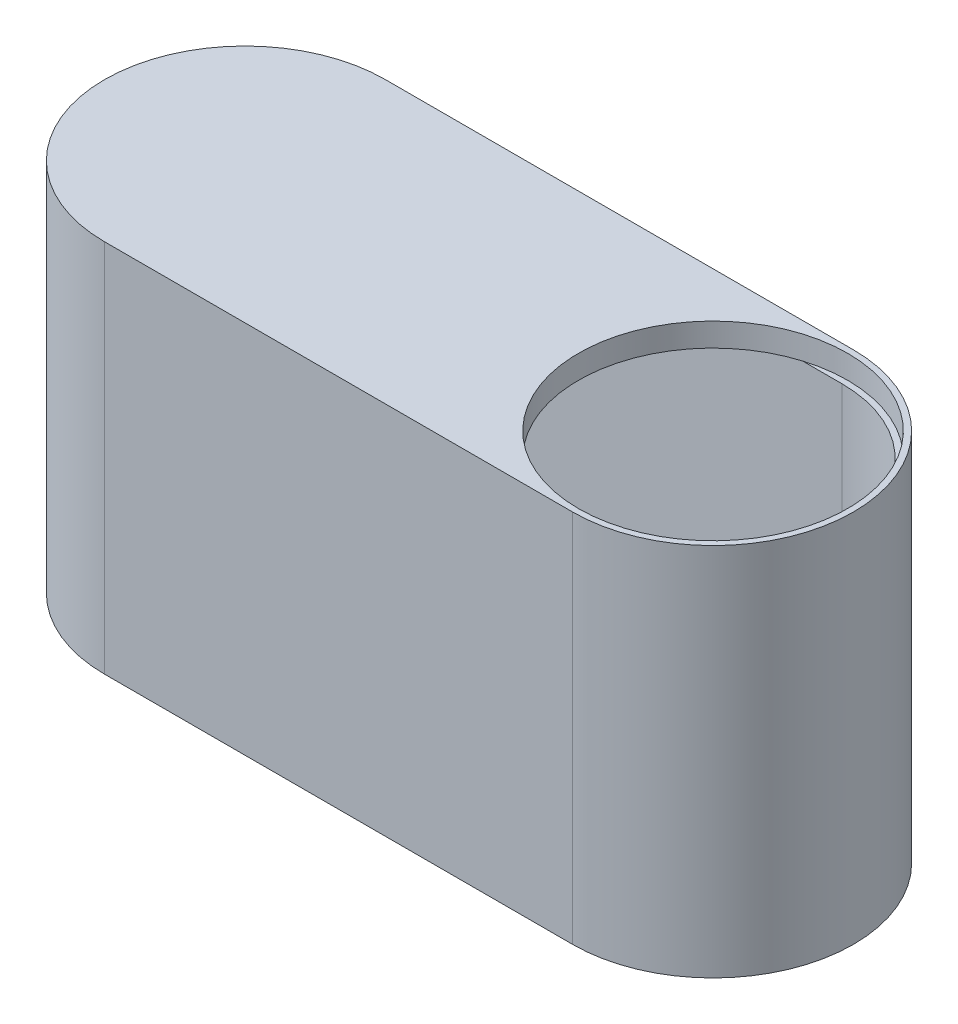
ISO-10303-21;
HEADER;
FILE_DESCRIPTION(('STEP AP214'),'2;1');
FILE_NAME('part.step','',(''),(''),'','','');
FILE_SCHEMA(('AUTOMOTIVE_DESIGN { 1 0 10303 214 1 1 1 1 }'));
ENDSEC;
DATA;
#1=APPLICATION_CONTEXT('core data for automotive mechanical design processes');
#2=APPLICATION_PROTOCOL_DEFINITION('international standard','automotive_design',2000,#1);
#3=PRODUCT_CONTEXT('',#1,'mechanical');
#4=PRODUCT('Part','Part','',(#3));
#5=PRODUCT_RELATED_PRODUCT_CATEGORY('part','',(#4));
#6=PRODUCT_DEFINITION_FORMATION('','',#4);
#7=PRODUCT_DEFINITION_CONTEXT('part definition',#1,'design');
#8=PRODUCT_DEFINITION('design','',#6,#7);
#9=PRODUCT_DEFINITION_SHAPE('','',#8);
#10=(LENGTH_UNIT() NAMED_UNIT(*) SI_UNIT(.MILLI.,.METRE.));
#11=(NAMED_UNIT(*) PLANE_ANGLE_UNIT() SI_UNIT($,.RADIAN.));
#12=(NAMED_UNIT(*) SI_UNIT($,.STERADIAN.) SOLID_ANGLE_UNIT());
#13=UNCERTAINTY_MEASURE_WITH_UNIT(LENGTH_MEASURE(1.E-05),#10,'distance_accuracy_value','');
#14=(GEOMETRIC_REPRESENTATION_CONTEXT(3) GLOBAL_UNCERTAINTY_ASSIGNED_CONTEXT((#13)) GLOBAL_UNIT_ASSIGNED_CONTEXT((#10,
#11,#12)) REPRESENTATION_CONTEXT('',''));
#15=CARTESIAN_POINT('',(0.,0.,0.));
#16=DIRECTION('',(0.,0.,1.));
#17=DIRECTION('',(1.,0.,0.));
#18=AXIS2_PLACEMENT_3D('',#15,#16,#17);
#19=CARTESIAN_POINT('',(77.2984425100702,30.,-53.6856409495745));
#20=DIRECTION('',(0.,1.,0.));
#21=DIRECTION('',(0.,0.,1.));
#22=AXIS2_PLACEMENT_3D('',#19,#20,#21);
#23=PLANE('',#22);
#24=DIRECTION('',(1.,0.,0.));
#25=VECTOR('',#24,1.);
#26=CARTESIAN_POINT('',(77.2984425100702,30.,-42.6856409495745));
#27=LINE('',#26,#25);
#28=CARTESIAN_POINT('',(113.944340543821,30.,-42.6856409495744));
#29=VERTEX_POINT('',#28);
#30=CARTESIAN_POINT('',(117.29844251007,30.,-42.6856409495744));
#31=VERTEX_POINT('',#30);
#32=EDGE_CURVE('E140',#29,#31,#27,.T.);
#33=ORIENTED_EDGE('',*,*,#32,.F.);
#34=CARTESIAN_POINT('',(117.29844251007,30.,-53.6856409495745));
#35=DIRECTION('',(0.,1.,0.));
#36=DIRECTION('',(0.,0.,1.));
#37=AXIS2_PLACEMENT_3D('',#34,#35,#36);
#38=CIRCLE('',#37,11.5);
#39=CARTESIAN_POINT('',(113.944340543821,30.,-64.6856409495745));
#40=VERTEX_POINT('',#39);
#41=EDGE_CURVE('E11',#29,#40,#38,.T.);
#42=ORIENTED_EDGE('',*,*,#41,.T.);
#43=DIRECTION('',(-1.,0.,0.));
#44=VECTOR('',#43,1.);
#45=CARTESIAN_POINT('',(77.2984425100702,30.,-64.6856409495745));
#46=LINE('',#45,#44);
#47=CARTESIAN_POINT('',(117.29844251007,30.,-64.6856409495745));
#48=VERTEX_POINT('',#47);
#49=EDGE_CURVE('E148',#48,#40,#46,.T.);
#50=ORIENTED_EDGE('',*,*,#49,.F.);
#51=CARTESIAN_POINT('',(117.29844251007,30.,-53.6856409495745));
#52=DIRECTION('',(0.,1.,0.));
#53=DIRECTION('',(0.,0.,1.));
#54=AXIS2_PLACEMENT_3D('',#51,#52,#53);
#55=CIRCLE('',#54,11.);
#56=EDGE_CURVE('E145',#31,#48,#55,.T.);
#57=ORIENTED_EDGE('',*,*,#56,.F.);
#58=EDGE_LOOP('',(#33,#42,#50,#57));
#59=FACE_BOUND('',#58,.T.);
#60=ADVANCED_FACE('F33',(#59),#23,.T.);
#61=CARTESIAN_POINT('',(77.2984425100702,0.,-53.6856409495745));
#62=DIRECTION('',(0.,1.,0.));
#63=DIRECTION('',(0.,0.,1.));
#64=AXIS2_PLACEMENT_3D('',#61,#62,#63);
#65=PLANE('',#64);
#66=CARTESIAN_POINT('',(77.2984425100702,0.,-53.6856409495745));
#67=DIRECTION('',(0.,1.,0.));
#68=DIRECTION('',(0.,0.,1.));
#69=AXIS2_PLACEMENT_3D('',#66,#67,#68);
#70=CIRCLE('',#69,12.);
#71=CARTESIAN_POINT('',(77.2984425100702,0.,-65.6856409495745));
#72=VERTEX_POINT('',#71);
#73=CARTESIAN_POINT('',(77.2984425100702,0.,-41.6856409495744));
#74=VERTEX_POINT('',#73);
#75=EDGE_CURVE('E112',#72,#74,#70,.T.);
#76=ORIENTED_EDGE('',*,*,#75,.F.);
#77=DIRECTION('',(-1.,0.,0.));
#78=VECTOR('',#77,1.);
#79=CARTESIAN_POINT('',(77.2984425100702,0.,-65.6856409495745));
#80=LINE('',#79,#78);
#81=CARTESIAN_POINT('',(117.29844251007,0.,-65.6856409495745));
#82=VERTEX_POINT('',#81);
#83=EDGE_CURVE('E174',#82,#72,#80,.T.);
#84=ORIENTED_EDGE('',*,*,#83,.F.);
#85=CARTESIAN_POINT('',(117.29844251007,0.,-53.6856409495745));
#86=DIRECTION('',(0.,1.,0.));
#87=DIRECTION('',(0.,0.,1.));
#88=AXIS2_PLACEMENT_3D('',#85,#86,#87);
#89=CIRCLE('',#88,12.);
#90=CARTESIAN_POINT('',(117.29844251007,0.,-41.6856409495744));
#91=VERTEX_POINT('',#90);
#92=EDGE_CURVE('E172',#91,#82,#89,.T.);
#93=ORIENTED_EDGE('',*,*,#92,.F.);
#94=DIRECTION('',(1.,0.,0.));
#95=VECTOR('',#94,1.);
#96=CARTESIAN_POINT('',(77.2984425100702,0.,-41.6856409495744));
#97=LINE('',#96,#95);
#98=EDGE_CURVE('E170',#74,#91,#97,.T.);
#99=ORIENTED_EDGE('',*,*,#98,.F.);
#100=EDGE_LOOP('',(#76,#84,#93,#99));
#101=FACE_BOUND('',#100,.T.);
#102=CARTESIAN_POINT('',(77.2984425100702,0.,-53.6856409495745));
#103=DIRECTION('',(0.,1.,0.));
#104=DIRECTION('',(0.,0.,1.));
#105=AXIS2_PLACEMENT_3D('',#102,#103,#104);
#106=CIRCLE('',#105,11.);
#107=CARTESIAN_POINT('',(77.2984425100702,0.,-64.6856409495745));
#108=VERTEX_POINT('',#107);
#109=CARTESIAN_POINT('',(77.2984425100702,0.,-42.6856409495745));
#110=VERTEX_POINT('',#109);
#111=EDGE_CURVE('E136',#108,#110,#106,.T.);
#112=ORIENTED_EDGE('',*,*,#111,.T.);
#113=DIRECTION('',(1.,0.,0.));
#114=VECTOR('',#113,1.);
#115=CARTESIAN_POINT('',(77.2984425100702,0.,-42.6856409495745));
#116=LINE('',#115,#114);
#117=CARTESIAN_POINT('',(117.29844251007,0.,-42.6856409495744));
#118=VERTEX_POINT('',#117);
#119=EDGE_CURVE('E153',#110,#118,#116,.T.);
#120=ORIENTED_EDGE('',*,*,#119,.T.);
#121=CARTESIAN_POINT('',(117.29844251007,0.,-53.6856409495745));
#122=DIRECTION('',(0.,1.,0.));
#123=DIRECTION('',(0.,0.,1.));
#124=AXIS2_PLACEMENT_3D('',#121,#122,#123);
#125=CIRCLE('',#124,11.);
#126=CARTESIAN_POINT('',(117.29844251007,0.,-64.6856409495745));
#127=VERTEX_POINT('',#126);
#128=EDGE_CURVE('E156',#118,#127,#125,.T.);
#129=ORIENTED_EDGE('',*,*,#128,.T.);
#130=DIRECTION('',(-1.,0.,0.));
#131=VECTOR('',#130,1.);
#132=CARTESIAN_POINT('',(77.2984425100702,0.,-64.6856409495745));
#133=LINE('',#132,#131);
#134=EDGE_CURVE('E141',#127,#108,#133,.T.);
#135=ORIENTED_EDGE('',*,*,#134,.T.);
#136=EDGE_LOOP('',(#112,#120,#129,#135));
#137=FACE_BOUND('',#136,.T.);
#138=ADVANCED_FACE('F185',(#101,#137),#65,.F.);
#139=CARTESIAN_POINT('',(77.2984425100702,30.,-53.6856409495745));
#140=DIRECTION('',(0.,-1.,0.));
#141=DIRECTION('',(0.,0.,-1.));
#142=AXIS2_PLACEMENT_3D('',#139,#140,#141);
#143=CYLINDRICAL_SURFACE('',#142,12.);
#144=ORIENTED_EDGE('',*,*,#75,.T.);
#145=DIRECTION('',(0.,-1.,0.));
#146=VECTOR('',#145,1.);
#147=CARTESIAN_POINT('',(77.2984425100702,30.,-41.6856409495744));
#148=LINE('',#147,#146);
#149=CARTESIAN_POINT('',(77.2984425100702,32.,-41.6856409495744));
#150=VERTEX_POINT('',#149);
#151=EDGE_CURVE('E37',#150,#74,#148,.T.);
#152=ORIENTED_EDGE('',*,*,#151,.F.);
#153=CARTESIAN_POINT('',(77.2984425100702,32.,-53.6856409495745));
#154=DIRECTION('',(0.,1.,0.));
#155=DIRECTION('',(0.,0.,1.));
#156=AXIS2_PLACEMENT_3D('',#153,#154,#155);
#157=CIRCLE('',#156,12.);
#158=CARTESIAN_POINT('',(77.2984425100702,32.,-65.6856409495745));
#159=VERTEX_POINT('',#158);
#160=EDGE_CURVE('E110',#159,#150,#157,.T.);
#161=ORIENTED_EDGE('',*,*,#160,.F.);
#162=DIRECTION('',(0.,-1.,0.));
#163=VECTOR('',#162,1.);
#164=CARTESIAN_POINT('',(77.2984425100702,30.,-65.6856409495745));
#165=LINE('',#164,#163);
#166=EDGE_CURVE('E176',#159,#72,#165,.T.);
#167=ORIENTED_EDGE('',*,*,#166,.T.);
#168=EDGE_LOOP('',(#144,#152,#161,#167));
#169=FACE_BOUND('',#168,.T.);
#170=ADVANCED_FACE('F35',(#169),#143,.T.);
#171=CARTESIAN_POINT('',(77.2984425100702,30.,-41.6856409495744));
#172=DIRECTION('',(0.,0.,-1.));
#173=DIRECTION('',(-1.,0.,0.));
#174=AXIS2_PLACEMENT_3D('',#171,#172,#173);
#175=PLANE('',#174);
#176=ORIENTED_EDGE('',*,*,#98,.T.);
#177=DIRECTION('',(0.,-1.,0.));
#178=VECTOR('',#177,1.);
#179=CARTESIAN_POINT('',(117.29844251007,30.,-41.6856409495744));
#180=LINE('',#179,#178);
#181=CARTESIAN_POINT('',(117.29844251007,32.,-41.6856409495744));
#182=VERTEX_POINT('',#181);
#183=EDGE_CURVE('E114',#182,#91,#180,.T.);
#184=ORIENTED_EDGE('',*,*,#183,.F.);
#185=DIRECTION('',(1.,0.,0.));
#186=VECTOR('',#185,1.);
#187=CARTESIAN_POINT('',(77.2984425100702,32.,-41.6856409495744));
#188=LINE('',#187,#186);
#189=EDGE_CURVE('E116',#150,#182,#188,.T.);
#190=ORIENTED_EDGE('',*,*,#189,.F.);
#191=ORIENTED_EDGE('',*,*,#151,.T.);
#192=EDGE_LOOP('',(#176,#184,#190,#191));
#193=FACE_BOUND('',#192,.T.);
#194=ADVANCED_FACE('F117',(#193),#175,.F.);
#195=CARTESIAN_POINT('',(117.29844251007,30.,-53.6856409495745));
#196=DIRECTION('',(0.,-1.,0.));
#197=DIRECTION('',(0.,0.,-1.));
#198=AXIS2_PLACEMENT_3D('',#195,#196,#197);
#199=CYLINDRICAL_SURFACE('',#198,12.);
#200=ORIENTED_EDGE('',*,*,#92,.T.);
#201=DIRECTION('',(0.,-1.,0.));
#202=VECTOR('',#201,1.);
#203=CARTESIAN_POINT('',(117.29844251007,30.,-65.6856409495745));
#204=LINE('',#203,#202);
#205=CARTESIAN_POINT('',(117.29844251007,32.,-65.6856409495745));
#206=VERTEX_POINT('',#205);
#207=EDGE_CURVE('E178',#206,#82,#204,.T.);
#208=ORIENTED_EDGE('',*,*,#207,.F.);
#209=CARTESIAN_POINT('',(117.29844251007,32.,-53.6856409495745));
#210=DIRECTION('',(0.,1.,0.));
#211=DIRECTION('',(0.,0.,1.));
#212=AXIS2_PLACEMENT_3D('',#209,#210,#211);
#213=CIRCLE('',#212,12.);
#214=EDGE_CURVE('E122',#182,#206,#213,.T.);
#215=ORIENTED_EDGE('',*,*,#214,.F.);
#216=ORIENTED_EDGE('',*,*,#183,.T.);
#217=EDGE_LOOP('',(#200,#208,#215,#216));
#218=FACE_BOUND('',#217,.T.);
#219=ADVANCED_FACE('F182',(#218),#199,.T.);
#220=CARTESIAN_POINT('',(77.2984425100702,30.,-65.6856409495745));
#221=DIRECTION('',(0.,0.,1.));
#222=DIRECTION('',(1.,0.,0.));
#223=AXIS2_PLACEMENT_3D('',#220,#221,#222);
#224=PLANE('',#223);
#225=ORIENTED_EDGE('',*,*,#83,.T.);
#226=ORIENTED_EDGE('',*,*,#166,.F.);
#227=DIRECTION('',(-1.,0.,0.));
#228=VECTOR('',#227,1.);
#229=CARTESIAN_POINT('',(77.2984425100702,32.,-65.6856409495745));
#230=LINE('',#229,#228);
#231=EDGE_CURVE('E128',#206,#159,#230,.T.);
#232=ORIENTED_EDGE('',*,*,#231,.F.);
#233=ORIENTED_EDGE('',*,*,#207,.T.);
#234=EDGE_LOOP('',(#225,#226,#232,#233));
#235=FACE_BOUND('',#234,.T.);
#236=ADVANCED_FACE('F188',(#235),#224,.F.);
#237=CARTESIAN_POINT('',(77.2984425100702,30.,-53.6856409495745));
#238=DIRECTION('',(0.,-1.,0.));
#239=DIRECTION('',(0.,0.,-1.));
#240=AXIS2_PLACEMENT_3D('',#237,#238,#239);
#241=CYLINDRICAL_SURFACE('',#240,11.);
#242=ORIENTED_EDGE('',*,*,#111,.F.);
#243=DIRECTION('',(0.,-1.,0.));
#244=VECTOR('',#243,1.);
#245=CARTESIAN_POINT('',(77.2984425100702,30.,-64.6856409495745));
#246=LINE('',#245,#244);
#247=CARTESIAN_POINT('',(77.2984425100702,30.,-64.6856409495745));
#248=VERTEX_POINT('',#247);
#249=EDGE_CURVE('E150',#248,#108,#246,.T.);
#250=ORIENTED_EDGE('',*,*,#249,.F.);
#251=CARTESIAN_POINT('',(77.2984425100702,30.,-53.6856409495745));
#252=DIRECTION('',(0.,1.,0.));
#253=DIRECTION('',(0.,0.,1.));
#254=AXIS2_PLACEMENT_3D('',#251,#252,#253);
#255=CIRCLE('',#254,11.);
#256=CARTESIAN_POINT('',(77.2984425100702,30.,-42.6856409495745));
#257=VERTEX_POINT('',#256);
#258=EDGE_CURVE('E137',#248,#257,#255,.T.);
#259=ORIENTED_EDGE('',*,*,#258,.T.);
#260=DIRECTION('',(0.,-1.,0.));
#261=VECTOR('',#260,1.);
#262=CARTESIAN_POINT('',(77.2984425100702,30.,-42.6856409495745));
#263=LINE('',#262,#261);
#264=EDGE_CURVE('E166',#257,#110,#263,.T.);
#265=ORIENTED_EDGE('',*,*,#264,.T.);
#266=EDGE_LOOP('',(#242,#250,#259,#265));
#267=FACE_BOUND('',#266,.T.);
#268=ADVANCED_FACE('F190',(#267),#241,.F.);
#269=CARTESIAN_POINT('',(77.2984425100702,30.,-42.6856409495745));
#270=DIRECTION('',(0.,0.,-1.));
#271=DIRECTION('',(-1.,0.,0.));
#272=AXIS2_PLACEMENT_3D('',#269,#270,#271);
#273=PLANE('',#272);
#274=ORIENTED_EDGE('',*,*,#119,.F.);
#275=ORIENTED_EDGE('',*,*,#264,.F.);
#276=EDGE_CURVE('E142',#257,#29,#27,.T.);
#277=ORIENTED_EDGE('',*,*,#276,.T.);
#278=ORIENTED_EDGE('',*,*,#32,.T.);
#279=DIRECTION('',(0.,-1.,0.));
#280=VECTOR('',#279,1.);
#281=CARTESIAN_POINT('',(117.29844251007,30.,-42.6856409495744));
#282=LINE('',#281,#280);
#283=EDGE_CURVE('E164',#31,#118,#282,.T.);
#284=ORIENTED_EDGE('',*,*,#283,.T.);
#285=EDGE_LOOP('',(#274,#275,#277,#278,#284));
#286=FACE_BOUND('',#285,.T.);
#287=ADVANCED_FACE('F196',(#286),#273,.T.);
#288=CARTESIAN_POINT('',(117.29844251007,30.,-53.6856409495745));
#289=DIRECTION('',(0.,-1.,0.));
#290=DIRECTION('',(0.,0.,-1.));
#291=AXIS2_PLACEMENT_3D('',#288,#289,#290);
#292=CYLINDRICAL_SURFACE('',#291,11.);
#293=ORIENTED_EDGE('',*,*,#128,.F.);
#294=ORIENTED_EDGE('',*,*,#283,.F.);
#295=ORIENTED_EDGE('',*,*,#56,.T.);
#296=DIRECTION('',(0.,-1.,0.));
#297=VECTOR('',#296,1.);
#298=CARTESIAN_POINT('',(117.29844251007,30.,-64.6856409495745));
#299=LINE('',#298,#297);
#300=EDGE_CURVE('E56',#48,#127,#299,.T.);
#301=ORIENTED_EDGE('',*,*,#300,.T.);
#302=EDGE_LOOP('',(#293,#294,#295,#301));
#303=FACE_BOUND('',#302,.T.);
#304=ADVANCED_FACE('F211',(#303),#292,.F.);
#305=CARTESIAN_POINT('',(77.2984425100702,30.,-64.6856409495745));
#306=DIRECTION('',(0.,0.,1.));
#307=DIRECTION('',(1.,0.,0.));
#308=AXIS2_PLACEMENT_3D('',#305,#306,#307);
#309=PLANE('',#308);
#310=ORIENTED_EDGE('',*,*,#134,.F.);
#311=ORIENTED_EDGE('',*,*,#300,.F.);
#312=ORIENTED_EDGE('',*,*,#49,.T.);
#313=EDGE_CURVE('E147',#40,#248,#46,.T.);
#314=ORIENTED_EDGE('',*,*,#313,.T.);
#315=ORIENTED_EDGE('',*,*,#249,.T.);
#316=EDGE_LOOP('',(#310,#311,#312,#314,#315));
#317=FACE_BOUND('',#316,.T.);
#318=ADVANCED_FACE('F215',(#317),#309,.T.);
#319=CARTESIAN_POINT('',(77.2984425100702,32.,-53.6856409495745));
#320=DIRECTION('',(0.,1.,0.));
#321=DIRECTION('',(0.,0.,1.));
#322=AXIS2_PLACEMENT_3D('',#319,#320,#321);
#323=PLANE('',#322);
#324=ORIENTED_EDGE('',*,*,#160,.T.);
#325=ORIENTED_EDGE('',*,*,#189,.T.);
#326=ORIENTED_EDGE('',*,*,#214,.T.);
#327=ORIENTED_EDGE('',*,*,#231,.T.);
#328=EDGE_LOOP('',(#324,#325,#326,#327));
#329=FACE_BOUND('',#328,.T.);
#330=CARTESIAN_POINT('',(117.29844251007,32.,-53.6856409495745));
#331=DIRECTION('',(0.,1.,0.));
#332=DIRECTION('',(0.,0.,1.));
#333=AXIS2_PLACEMENT_3D('',#330,#331,#332);
#334=CIRCLE('',#333,11.5);
#335=CARTESIAN_POINT('',(117.29844251007,32.,-42.1856409495745));
#336=VERTEX_POINT('',#335);
#337=EDGE_CURVE('E129',#336,#336,#334,.T.);
#338=ORIENTED_EDGE('',*,*,#337,.F.);
#339=EDGE_LOOP('',(#338));
#340=FACE_BOUND('',#339,.T.);
#341=ADVANCED_FACE('F125',(#329,#340),#323,.T.);
#342=CARTESIAN_POINT('',(77.2984425100702,30.,-53.6856409495745));
#343=DIRECTION('',(0.,1.,0.));
#344=DIRECTION('',(0.,0.,1.));
#345=AXIS2_PLACEMENT_3D('',#342,#343,#344);
#346=PLANE('',#345);
#347=ORIENTED_EDGE('',*,*,#276,.F.);
#348=ORIENTED_EDGE('',*,*,#258,.F.);
#349=ORIENTED_EDGE('',*,*,#313,.F.);
#350=EDGE_CURVE('E43',#40,#29,#38,.T.);
#351=ORIENTED_EDGE('',*,*,#350,.T.);
#352=EDGE_LOOP('',(#347,#348,#349,#351));
#353=FACE_BOUND('',#352,.T.);
#354=ADVANCED_FACE('F219',(#353),#346,.F.);
#355=CARTESIAN_POINT('',(117.29844251007,32.,-53.6856409495745));
#356=DIRECTION('',(0.,-1.,0.));
#357=DIRECTION('',(0.,0.,-1.));
#358=AXIS2_PLACEMENT_3D('',#355,#356,#357);
#359=CYLINDRICAL_SURFACE('',#358,11.5);
#360=ORIENTED_EDGE('',*,*,#337,.T.);
#361=EDGE_LOOP('',(#360));
#362=FACE_BOUND('',#361,.T.);
#363=ORIENTED_EDGE('',*,*,#350,.F.);
#364=ORIENTED_EDGE('',*,*,#41,.F.);
#365=EDGE_LOOP('',(#363,#364));
#366=FACE_BOUND('',#365,.T.);
#367=ADVANCED_FACE('F222',(#362,#366),#359,.F.);
#368=CLOSED_SHELL('',(#60,#138,#170,#194,#219,#236,#268,#287,#304,#318,#341,#354,#367));
#369=MANIFOLD_SOLID_BREP('B2',#368);
#370=ADVANCED_BREP_SHAPE_REPRESENTATION('',(#18,#369),#14);
#371=SHAPE_DEFINITION_REPRESENTATION(#9,#370);
ENDSEC;
END-ISO-10303-21;
